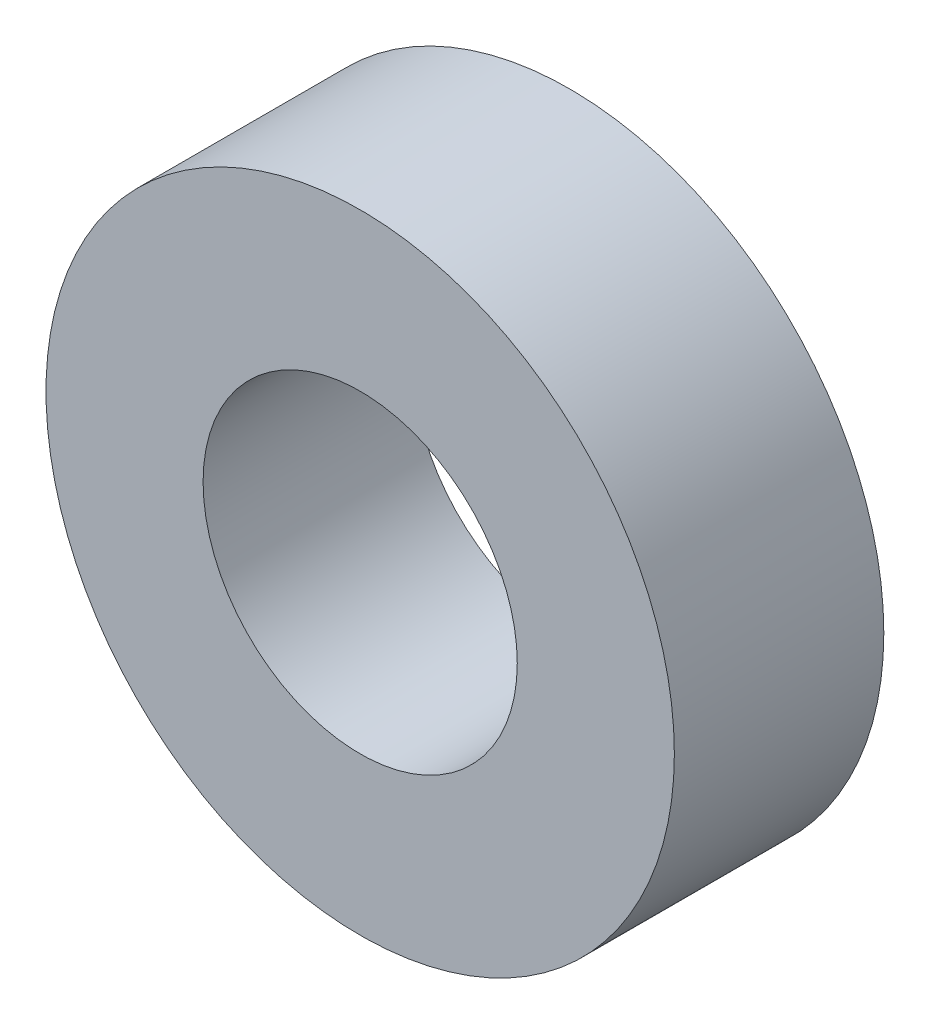
ISO-10303-21;
HEADER;
FILE_DESCRIPTION(('STEP AP214'),'2;1');
FILE_NAME('part.step','',(''),(''),'','','');
FILE_SCHEMA(('AUTOMOTIVE_DESIGN { 1 0 10303 214 1 1 1 1 }'));
ENDSEC;
DATA;
#1=APPLICATION_CONTEXT('core data for automotive mechanical design processes');
#2=APPLICATION_PROTOCOL_DEFINITION('international standard','automotive_design',2000,#1);
#3=PRODUCT_CONTEXT('',#1,'mechanical');
#4=PRODUCT('Part','Part','',(#3));
#5=PRODUCT_RELATED_PRODUCT_CATEGORY('part','',(#4));
#6=PRODUCT_DEFINITION_FORMATION('','',#4);
#7=PRODUCT_DEFINITION_CONTEXT('part definition',#1,'design');
#8=PRODUCT_DEFINITION('design','',#6,#7);
#9=PRODUCT_DEFINITION_SHAPE('','',#8);
#10=(LENGTH_UNIT() NAMED_UNIT(*) SI_UNIT(.MILLI.,.METRE.));
#11=(NAMED_UNIT(*) PLANE_ANGLE_UNIT() SI_UNIT($,.RADIAN.));
#12=(NAMED_UNIT(*) SI_UNIT($,.STERADIAN.) SOLID_ANGLE_UNIT());
#13=UNCERTAINTY_MEASURE_WITH_UNIT(LENGTH_MEASURE(1.E-05),#10,'distance_accuracy_value','');
#14=(GEOMETRIC_REPRESENTATION_CONTEXT(3) GLOBAL_UNCERTAINTY_ASSIGNED_CONTEXT((#13)) GLOBAL_UNIT_ASSIGNED_CONTEXT((#10,
#11,#12)) REPRESENTATION_CONTEXT('',''));
#15=CARTESIAN_POINT('',(0.,0.,0.));
#16=DIRECTION('',(0.,0.,1.));
#17=DIRECTION('',(1.,0.,0.));
#18=AXIS2_PLACEMENT_3D('',#15,#16,#17);
#19=CARTESIAN_POINT('',(0.,0.,0.));
#20=DIRECTION('',(0.,0.,1.));
#21=DIRECTION('',(1.,0.,0.));
#22=AXIS2_PLACEMENT_3D('',#19,#20,#21);
#23=CYLINDRICAL_SURFACE('',#22,3.);
#24=CARTESIAN_POINT('',(0.,0.,-4.));
#25=DIRECTION('',(0.,0.,1.));
#26=DIRECTION('',(1.,0.,0.));
#27=AXIS2_PLACEMENT_3D('',#24,#25,#26);
#28=CIRCLE('',#27,3.);
#29=CARTESIAN_POINT('',(3.,0.,-4.));
#30=VERTEX_POINT('',#29);
#31=EDGE_CURVE('E49',#30,#30,#28,.T.);
#32=ORIENTED_EDGE('',*,*,#31,.F.);
#33=EDGE_LOOP('',(#32));
#34=FACE_BOUND('',#33,.T.);
#35=CARTESIAN_POINT('',(0.,0.,0.));
#36=DIRECTION('',(0.,0.,1.));
#37=DIRECTION('',(1.,0.,0.));
#38=AXIS2_PLACEMENT_3D('',#35,#36,#37);
#39=CIRCLE('',#38,3.);
#40=CARTESIAN_POINT('',(3.,0.,0.));
#41=VERTEX_POINT('',#40);
#42=EDGE_CURVE('E10',#41,#41,#39,.T.);
#43=ORIENTED_EDGE('',*,*,#42,.T.);
#44=EDGE_LOOP('',(#43));
#45=FACE_BOUND('',#44,.T.);
#46=ADVANCED_FACE('F34',(#34,#45),#23,.F.);
#47=CARTESIAN_POINT('',(-3.,0.,0.));
#48=DIRECTION('',(0.,0.,-1.));
#49=DIRECTION('',(-1.,0.,0.));
#50=AXIS2_PLACEMENT_3D('',#47,#48,#49);
#51=PLANE('',#50);
#52=ORIENTED_EDGE('',*,*,#42,.F.);
#53=EDGE_LOOP('',(#52));
#54=FACE_BOUND('',#53,.T.);
#55=CARTESIAN_POINT('',(0.,0.,0.));
#56=DIRECTION('',(0.,0.,1.));
#57=DIRECTION('',(1.,0.,0.));
#58=AXIS2_PLACEMENT_3D('',#55,#56,#57);
#59=CIRCLE('',#58,6.);
#60=CARTESIAN_POINT('',(6.,0.,0.));
#61=VERTEX_POINT('',#60);
#62=EDGE_CURVE('E41',#61,#61,#59,.T.);
#63=ORIENTED_EDGE('',*,*,#62,.T.);
#64=EDGE_LOOP('',(#63));
#65=FACE_BOUND('',#64,.T.);
#66=ADVANCED_FACE('F58',(#54,#65),#51,.F.);
#67=CARTESIAN_POINT('',(0.,0.,0.));
#68=DIRECTION('',(0.,0.,1.));
#69=DIRECTION('',(1.,0.,0.));
#70=AXIS2_PLACEMENT_3D('',#67,#68,#69);
#71=CYLINDRICAL_SURFACE('',#70,6.);
#72=ORIENTED_EDGE('',*,*,#62,.F.);
#73=EDGE_LOOP('',(#72));
#74=FACE_BOUND('',#73,.T.);
#75=CARTESIAN_POINT('',(0.,0.,-4.));
#76=DIRECTION('',(0.,0.,1.));
#77=DIRECTION('',(1.,0.,0.));
#78=AXIS2_PLACEMENT_3D('',#75,#76,#77);
#79=CIRCLE('',#78,6.);
#80=CARTESIAN_POINT('',(6.,0.,-4.));
#81=VERTEX_POINT('',#80);
#82=EDGE_CURVE('E45',#81,#81,#79,.T.);
#83=ORIENTED_EDGE('',*,*,#82,.T.);
#84=EDGE_LOOP('',(#83));
#85=FACE_BOUND('',#84,.T.);
#86=ADVANCED_FACE('F62',(#74,#85),#71,.T.);
#87=CARTESIAN_POINT('',(-6.,0.,-4.));
#88=DIRECTION('',(0.,0.,1.));
#89=DIRECTION('',(1.,0.,0.));
#90=AXIS2_PLACEMENT_3D('',#87,#88,#89);
#91=PLANE('',#90);
#92=ORIENTED_EDGE('',*,*,#82,.F.);
#93=EDGE_LOOP('',(#92));
#94=FACE_BOUND('',#93,.T.);
#95=ORIENTED_EDGE('',*,*,#31,.T.);
#96=EDGE_LOOP('',(#95));
#97=FACE_BOUND('',#96,.T.);
#98=ADVANCED_FACE('F55',(#94,#97),#91,.F.);
#99=CLOSED_SHELL('',(#46,#66,#86,#98));
#100=CARTESIAN_POINT('',(0.,0.,-2.5));
#101=DIRECTION('',(0.,0.,1.));
#102=DIRECTION('',(1.,0.,0.));
#103=AXIS2_PLACEMENT_3D('',#100,#101,#102);
#104=TOROIDAL_SURFACE('',#103,4.5,0.500000000000001);
#105=CARTESIAN_POINT('',(5.,0.,-2.5));
#106=VERTEX_POINT('',#105);
#107=VERTEX_LOOP('',#106);
#108=FACE_BOUND('',#107,.T.);
#109=ADVANCED_FACE('F73',(#108),#104,.F.);
#110=CLOSED_SHELL('',(#109));
#111=ORIENTED_CLOSED_SHELL('',*,#110,.T.);
#112=BREP_WITH_VOIDS('B2',#99,(#111));
#113=ADVANCED_BREP_SHAPE_REPRESENTATION('',(#18,#112),#14);
#114=SHAPE_DEFINITION_REPRESENTATION(#9,#113);
ENDSEC;
END-ISO-10303-21;
